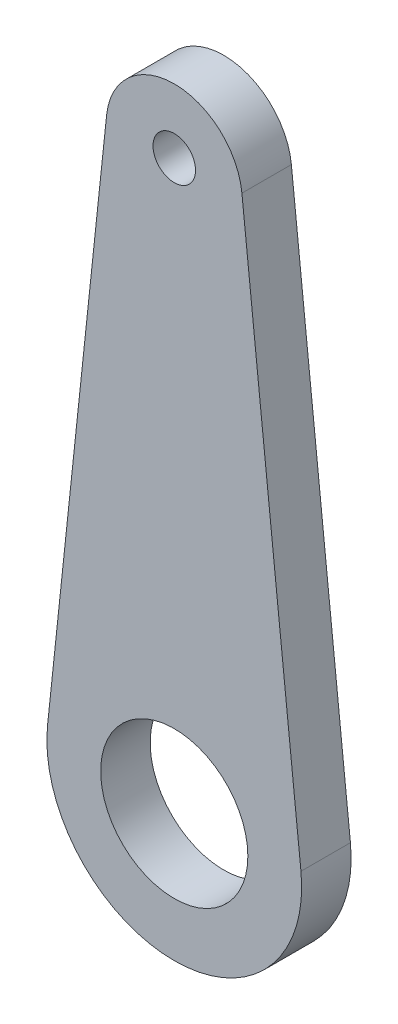
ISO-10303-21;
HEADER;
FILE_DESCRIPTION(('STEP AP214'),'2;1');
FILE_NAME('part.step','',(''),(''),'','','');
FILE_SCHEMA(('AUTOMOTIVE_DESIGN { 1 0 10303 214 1 1 1 1 }'));
ENDSEC;
DATA;
#1=APPLICATION_CONTEXT('core data for automotive mechanical design processes');
#2=APPLICATION_PROTOCOL_DEFINITION('international standard','automotive_design',2000,#1);
#3=PRODUCT_CONTEXT('',#1,'mechanical');
#4=PRODUCT('Part','Part','',(#3));
#5=PRODUCT_RELATED_PRODUCT_CATEGORY('part','',(#4));
#6=PRODUCT_DEFINITION_FORMATION('','',#4);
#7=PRODUCT_DEFINITION_CONTEXT('part definition',#1,'design');
#8=PRODUCT_DEFINITION('design','',#6,#7);
#9=PRODUCT_DEFINITION_SHAPE('','',#8);
#10=(LENGTH_UNIT() NAMED_UNIT(*) SI_UNIT(.MILLI.,.METRE.));
#11=(NAMED_UNIT(*) PLANE_ANGLE_UNIT() SI_UNIT($,.RADIAN.));
#12=(NAMED_UNIT(*) SI_UNIT($,.STERADIAN.) SOLID_ANGLE_UNIT());
#13=UNCERTAINTY_MEASURE_WITH_UNIT(LENGTH_MEASURE(1.E-05),#10,'distance_accuracy_value','');
#14=(GEOMETRIC_REPRESENTATION_CONTEXT(3) GLOBAL_UNCERTAINTY_ASSIGNED_CONTEXT((#13)) GLOBAL_UNIT_ASSIGNED_CONTEXT((#10,
#11,#12)) REPRESENTATION_CONTEXT('',''));
#15=CARTESIAN_POINT('',(0.,0.,0.));
#16=DIRECTION('',(0.,0.,1.));
#17=DIRECTION('',(1.,0.,0.));
#18=AXIS2_PLACEMENT_3D('',#15,#16,#17);
#19=CARTESIAN_POINT('',(0.,0.,2.54));
#20=DIRECTION('',(0.,0.,1.));
#21=DIRECTION('',(1.,0.,0.));
#22=AXIS2_PLACEMENT_3D('',#19,#20,#21);
#23=PLANE('',#22);
#24=CARTESIAN_POINT('',(0.,0.,2.54));
#25=DIRECTION('',(0.,0.,1.));
#26=DIRECTION('',(1.,0.,0.));
#27=AXIS2_PLACEMENT_3D('',#24,#25,#26);
#28=CIRCLE('',#27,3.77825);
#29=CARTESIAN_POINT('',(3.77825,0.,2.54));
#30=VERTEX_POINT('',#29);
#31=EDGE_CURVE('E99',#30,#30,#28,.T.);
#32=ORIENTED_EDGE('',*,*,#31,.F.);
#33=EDGE_LOOP('',(#32));
#34=FACE_BOUND('',#33,.T.);
#35=CARTESIAN_POINT('',(0.,0.,2.54));
#36=DIRECTION('',(0.,0.,1.));
#37=DIRECTION('',(1.,0.,0.));
#38=AXIS2_PLACEMENT_3D('',#35,#36,#37);
#39=CIRCLE('',#38,6.5405);
#40=CARTESIAN_POINT('',(-6.50416360773233,0.688473684210527,2.54));
#41=VERTEX_POINT('',#40);
#42=CARTESIAN_POINT('',(6.50416360773233,0.688473684210527,2.54));
#43=VERTEX_POINT('',#42);
#44=EDGE_CURVE('E84',#41,#43,#39,.T.);
#45=ORIENTED_EDGE('',*,*,#44,.T.);
#46=DIRECTION('',(-0.105263157894737,0.994444401457431,0.));
#47=VECTOR('',#46,1.);
#48=CARTESIAN_POINT('',(6.50416360773233,0.688473684210527,2.54));
#49=LINE('',#48,#47);
#50=CARTESIAN_POINT('',(3.47309707209008,29.3236315789474,2.54));
#51=VERTEX_POINT('',#50);
#52=EDGE_CURVE('E79',#43,#51,#49,.T.);
#53=ORIENTED_EDGE('',*,*,#52,.T.);
#54=CARTESIAN_POINT('',(0.,28.956,2.54));
#55=DIRECTION('',(0.,0.,1.));
#56=DIRECTION('',(1.,0.,0.));
#57=AXIS2_PLACEMENT_3D('',#54,#55,#56);
#58=CIRCLE('',#57,3.4925);
#59=CARTESIAN_POINT('',(-3.47309707209008,29.3236315789474,2.54));
#60=VERTEX_POINT('',#59);
#61=EDGE_CURVE('E82',#51,#60,#58,.T.);
#62=ORIENTED_EDGE('',*,*,#61,.T.);
#63=DIRECTION('',(-0.105263157894737,-0.994444401457431,0.));
#64=VECTOR('',#63,1.);
#65=CARTESIAN_POINT('',(-6.50416360773233,0.688473684210527,2.54));
#66=LINE('',#65,#64);
#67=EDGE_CURVE('E49',#60,#41,#66,.T.);
#68=ORIENTED_EDGE('',*,*,#67,.T.);
#69=EDGE_LOOP('',(#45,#53,#62,#68));
#70=FACE_BOUND('',#69,.T.);
#71=CARTESIAN_POINT('',(0.,29.1465,2.54));
#72=DIRECTION('',(0.,0.,1.));
#73=DIRECTION('',(1.,0.,0.));
#74=AXIS2_PLACEMENT_3D('',#71,#72,#73);
#75=CIRCLE('',#74,1.0922);
#76=CARTESIAN_POINT('',(1.0922,29.1465,2.54));
#77=VERTEX_POINT('',#76);
#78=EDGE_CURVE('E114',#77,#77,#75,.T.);
#79=ORIENTED_EDGE('',*,*,#78,.F.);
#80=EDGE_LOOP('',(#79));
#81=FACE_BOUND('',#80,.T.);
#82=ADVANCED_FACE('F32',(#34,#70,#81),#23,.T.);
#83=CARTESIAN_POINT('',(0.,0.,0.));
#84=DIRECTION('',(0.,0.,1.));
#85=DIRECTION('',(1.,0.,0.));
#86=AXIS2_PLACEMENT_3D('',#83,#84,#85);
#87=PLANE('',#86);
#88=CARTESIAN_POINT('',(0.,0.,0.));
#89=DIRECTION('',(0.,0.,1.));
#90=DIRECTION('',(1.,0.,0.));
#91=AXIS2_PLACEMENT_3D('',#88,#89,#90);
#92=CIRCLE('',#91,6.5405);
#93=CARTESIAN_POINT('',(-6.50416360773233,0.688473684210527,0.));
#94=VERTEX_POINT('',#93);
#95=CARTESIAN_POINT('',(6.50416360773233,0.688473684210527,0.));
#96=VERTEX_POINT('',#95);
#97=EDGE_CURVE('E96',#94,#96,#92,.T.);
#98=ORIENTED_EDGE('',*,*,#97,.F.);
#99=DIRECTION('',(-0.105263157894737,-0.994444401457431,0.));
#100=VECTOR('',#99,1.);
#101=CARTESIAN_POINT('',(-6.50416360773233,0.688473684210527,0.));
#102=LINE('',#101,#100);
#103=CARTESIAN_POINT('',(-3.47309707209008,29.3236315789474,0.));
#104=VERTEX_POINT('',#103);
#105=EDGE_CURVE('E72',#104,#94,#102,.T.);
#106=ORIENTED_EDGE('',*,*,#105,.F.);
#107=CARTESIAN_POINT('',(0.,28.956,0.));
#108=DIRECTION('',(0.,0.,1.));
#109=DIRECTION('',(1.,0.,0.));
#110=AXIS2_PLACEMENT_3D('',#107,#108,#109);
#111=CIRCLE('',#110,3.4925);
#112=CARTESIAN_POINT('',(3.47309707209008,29.3236315789474,0.));
#113=VERTEX_POINT('',#112);
#114=EDGE_CURVE('E66',#113,#104,#111,.T.);
#115=ORIENTED_EDGE('',*,*,#114,.F.);
#116=DIRECTION('',(-0.105263157894737,0.994444401457431,0.));
#117=VECTOR('',#116,1.);
#118=CARTESIAN_POINT('',(6.50416360773233,0.688473684210527,0.));
#119=LINE('',#118,#117);
#120=EDGE_CURVE('E88',#96,#113,#119,.T.);
#121=ORIENTED_EDGE('',*,*,#120,.F.);
#122=EDGE_LOOP('',(#98,#106,#115,#121));
#123=FACE_BOUND('',#122,.T.);
#124=CARTESIAN_POINT('',(0.,0.,0.));
#125=DIRECTION('',(0.,0.,1.));
#126=DIRECTION('',(1.,0.,0.));
#127=AXIS2_PLACEMENT_3D('',#124,#125,#126);
#128=CIRCLE('',#127,3.77825);
#129=CARTESIAN_POINT('',(3.77825,0.,0.));
#130=VERTEX_POINT('',#129);
#131=EDGE_CURVE('E111',#130,#130,#128,.T.);
#132=ORIENTED_EDGE('',*,*,#131,.T.);
#133=EDGE_LOOP('',(#132));
#134=FACE_BOUND('',#133,.T.);
#135=CARTESIAN_POINT('',(0.,29.1465,0.));
#136=DIRECTION('',(0.,0.,1.));
#137=DIRECTION('',(1.,0.,0.));
#138=AXIS2_PLACEMENT_3D('',#135,#136,#137);
#139=CIRCLE('',#138,1.0922);
#140=CARTESIAN_POINT('',(1.0922,29.1465,0.));
#141=VERTEX_POINT('',#140);
#142=EDGE_CURVE('E117',#141,#141,#139,.T.);
#143=ORIENTED_EDGE('',*,*,#142,.T.);
#144=EDGE_LOOP('',(#143));
#145=FACE_BOUND('',#144,.T.);
#146=ADVANCED_FACE('F107',(#123,#134,#145),#87,.F.);
#147=CARTESIAN_POINT('',(0.,0.,2.54));
#148=DIRECTION('',(0.,0.,-1.));
#149=DIRECTION('',(-1.,0.,0.));
#150=AXIS2_PLACEMENT_3D('',#147,#148,#149);
#151=CYLINDRICAL_SURFACE('',#150,6.5405);
#152=ORIENTED_EDGE('',*,*,#97,.T.);
#153=DIRECTION('',(0.,0.,-1.));
#154=VECTOR('',#153,1.);
#155=CARTESIAN_POINT('',(6.50416360773233,0.688473684210527,2.54));
#156=LINE('',#155,#154);
#157=EDGE_CURVE('E11',#43,#96,#156,.T.);
#158=ORIENTED_EDGE('',*,*,#157,.F.);
#159=ORIENTED_EDGE('',*,*,#44,.F.);
#160=DIRECTION('',(0.,0.,-1.));
#161=VECTOR('',#160,1.);
#162=CARTESIAN_POINT('',(-6.50416360773233,0.688473684210527,2.54));
#163=LINE('',#162,#161);
#164=EDGE_CURVE('E92',#41,#94,#163,.T.);
#165=ORIENTED_EDGE('',*,*,#164,.T.);
#166=EDGE_LOOP('',(#152,#158,#159,#165));
#167=FACE_BOUND('',#166,.T.);
#168=ADVANCED_FACE('F34',(#167),#151,.T.);
#169=CARTESIAN_POINT('',(6.50416360773233,0.688473684210527,2.54));
#170=DIRECTION('',(-0.994444401457431,-0.105263157894737,0.));
#171=DIRECTION('',(0.105263157894737,-0.994444401457431,0.));
#172=AXIS2_PLACEMENT_3D('',#169,#170,#171);
#173=PLANE('',#172);
#174=ORIENTED_EDGE('',*,*,#120,.T.);
#175=DIRECTION('',(0.,0.,-1.));
#176=VECTOR('',#175,1.);
#177=CARTESIAN_POINT('',(3.47309707209008,29.3236315789474,2.54));
#178=LINE('',#177,#176);
#179=EDGE_CURVE('E41',#51,#113,#178,.T.);
#180=ORIENTED_EDGE('',*,*,#179,.F.);
#181=ORIENTED_EDGE('',*,*,#52,.F.);
#182=ORIENTED_EDGE('',*,*,#157,.T.);
#183=EDGE_LOOP('',(#174,#180,#181,#182));
#184=FACE_BOUND('',#183,.T.);
#185=ADVANCED_FACE('F87',(#184),#173,.F.);
#186=CARTESIAN_POINT('',(0.,28.956,2.54));
#187=DIRECTION('',(0.,0.,-1.));
#188=DIRECTION('',(-1.,0.,0.));
#189=AXIS2_PLACEMENT_3D('',#186,#187,#188);
#190=CYLINDRICAL_SURFACE('',#189,3.4925);
#191=ORIENTED_EDGE('',*,*,#114,.T.);
#192=DIRECTION('',(0.,0.,-1.));
#193=VECTOR('',#192,1.);
#194=CARTESIAN_POINT('',(-3.47309707209008,29.3236315789474,2.54));
#195=LINE('',#194,#193);
#196=EDGE_CURVE('E89',#60,#104,#195,.T.);
#197=ORIENTED_EDGE('',*,*,#196,.F.);
#198=ORIENTED_EDGE('',*,*,#61,.F.);
#199=ORIENTED_EDGE('',*,*,#179,.T.);
#200=EDGE_LOOP('',(#191,#197,#198,#199));
#201=FACE_BOUND('',#200,.T.);
#202=ADVANCED_FACE('F90',(#201),#190,.T.);
#203=CARTESIAN_POINT('',(-6.50416360773233,0.688473684210527,2.54));
#204=DIRECTION('',(0.994444401457431,-0.105263157894737,0.));
#205=DIRECTION('',(0.105263157894737,0.994444401457431,0.));
#206=AXIS2_PLACEMENT_3D('',#203,#204,#205);
#207=PLANE('',#206);
#208=ORIENTED_EDGE('',*,*,#105,.T.);
#209=ORIENTED_EDGE('',*,*,#164,.F.);
#210=ORIENTED_EDGE('',*,*,#67,.F.);
#211=ORIENTED_EDGE('',*,*,#196,.T.);
#212=EDGE_LOOP('',(#208,#209,#210,#211));
#213=FACE_BOUND('',#212,.T.);
#214=ADVANCED_FACE('F104',(#213),#207,.F.);
#215=CARTESIAN_POINT('',(0.,0.,2.54));
#216=DIRECTION('',(0.,0.,-1.));
#217=DIRECTION('',(-1.,0.,0.));
#218=AXIS2_PLACEMENT_3D('',#215,#216,#217);
#219=CYLINDRICAL_SURFACE('',#218,3.77825);
#220=ORIENTED_EDGE('',*,*,#31,.T.);
#221=EDGE_LOOP('',(#220));
#222=FACE_BOUND('',#221,.T.);
#223=ORIENTED_EDGE('',*,*,#131,.F.);
#224=EDGE_LOOP('',(#223));
#225=FACE_BOUND('',#224,.T.);
#226=ADVANCED_FACE('F134',(#222,#225),#219,.F.);
#227=CARTESIAN_POINT('',(0.,29.1465,2.54));
#228=DIRECTION('',(0.,0.,-1.));
#229=DIRECTION('',(-1.,0.,0.));
#230=AXIS2_PLACEMENT_3D('',#227,#228,#229);
#231=CYLINDRICAL_SURFACE('',#230,1.0922);
#232=ORIENTED_EDGE('',*,*,#78,.T.);
#233=EDGE_LOOP('',(#232));
#234=FACE_BOUND('',#233,.T.);
#235=ORIENTED_EDGE('',*,*,#142,.F.);
#236=EDGE_LOOP('',(#235));
#237=FACE_BOUND('',#236,.T.);
#238=ADVANCED_FACE('F123',(#234,#237),#231,.F.);
#239=CLOSED_SHELL('',(#82,#146,#168,#185,#202,#214,#226,#238));
#240=MANIFOLD_SOLID_BREP('B2',#239);
#241=ADVANCED_BREP_SHAPE_REPRESENTATION('',(#18,#240),#14);
#242=SHAPE_DEFINITION_REPRESENTATION(#9,#241);
ENDSEC;
END-ISO-10303-21;
